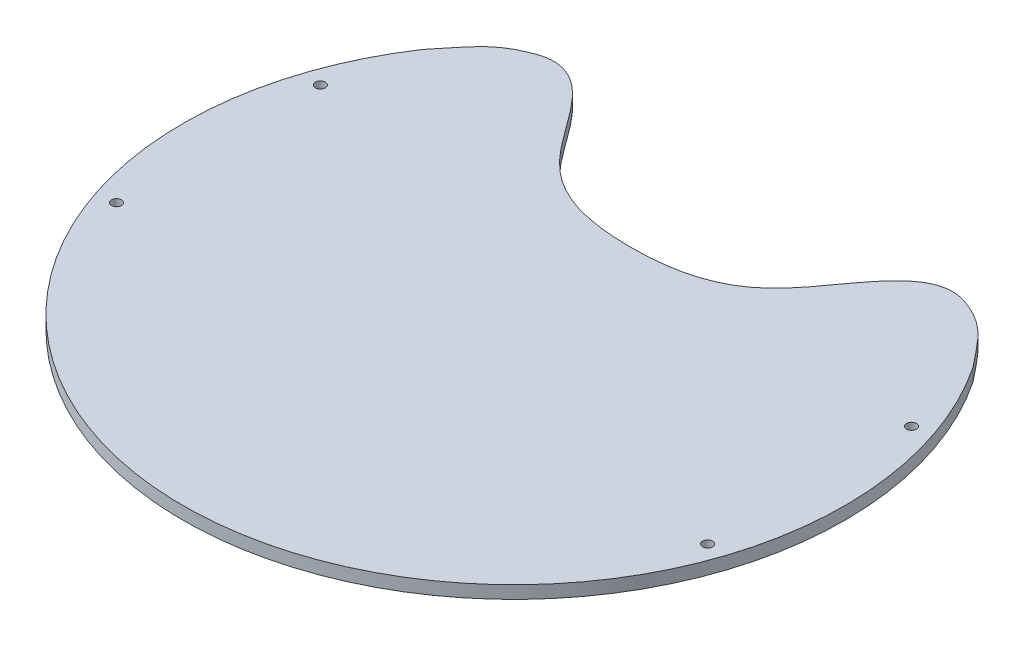
ISO-10303-21;
HEADER;
FILE_DESCRIPTION(('STEP AP214'),'2;1');
FILE_NAME('part.step','',(''),(''),'','','');
FILE_SCHEMA(('AUTOMOTIVE_DESIGN { 1 0 10303 214 1 1 1 1 }'));
ENDSEC;
DATA;
#1=APPLICATION_CONTEXT('core data for automotive mechanical design processes');
#2=APPLICATION_PROTOCOL_DEFINITION('international standard','automotive_design',2000,#1);
#3=PRODUCT_CONTEXT('',#1,'mechanical');
#4=PRODUCT('Part','Part','',(#3));
#5=PRODUCT_RELATED_PRODUCT_CATEGORY('part','',(#4));
#6=PRODUCT_DEFINITION_FORMATION('','',#4);
#7=PRODUCT_DEFINITION_CONTEXT('part definition',#1,'design');
#8=PRODUCT_DEFINITION('design','',#6,#7);
#9=PRODUCT_DEFINITION_SHAPE('','',#8);
#10=(LENGTH_UNIT() NAMED_UNIT(*) SI_UNIT(.MILLI.,.METRE.));
#11=(NAMED_UNIT(*) PLANE_ANGLE_UNIT() SI_UNIT($,.RADIAN.));
#12=(NAMED_UNIT(*) SI_UNIT($,.STERADIAN.) SOLID_ANGLE_UNIT());
#13=UNCERTAINTY_MEASURE_WITH_UNIT(LENGTH_MEASURE(1.E-05),#10,'distance_accuracy_value','');
#14=(GEOMETRIC_REPRESENTATION_CONTEXT(3) GLOBAL_UNCERTAINTY_ASSIGNED_CONTEXT((#13)) GLOBAL_UNIT_ASSIGNED_CONTEXT((#10,
#11,#12)) REPRESENTATION_CONTEXT('',''));
#15=CARTESIAN_POINT('',(0.,0.,0.));
#16=DIRECTION('',(0.,0.,1.));
#17=DIRECTION('',(1.,0.,0.));
#18=AXIS2_PLACEMENT_3D('',#15,#16,#17);
#19=CARTESIAN_POINT('',(0.,6.35,0.));
#20=DIRECTION('',(0.,-1.,0.));
#21=DIRECTION('',(0.,0.,-1.));
#22=AXIS2_PLACEMENT_3D('',#19,#20,#21);
#23=CYLINDRICAL_SURFACE('',#22,164.975);
#24=DIRECTION('',(0.,-1.,0.));
#25=VECTOR('',#24,1.);
#26=CARTESIAN_POINT('',(-137.173488464119,589.678712407293,-91.6525214469529));
#27=LINE('',#26,#25);
#28=CARTESIAN_POINT('',(-137.173488464119,6.35,-91.6525214469529));
#29=VERTEX_POINT('',#28);
#30=CARTESIAN_POINT('',(-137.173488464119,0.,-91.6525214469529));
#31=VERTEX_POINT('',#30);
#32=EDGE_CURVE('E83',#29,#31,#27,.T.);
#33=ORIENTED_EDGE('',*,*,#32,.T.);
#34=CARTESIAN_POINT('',(0.,0.,0.));
#35=DIRECTION('',(0.,1.,0.));
#36=DIRECTION('',(0.,0.,1.));
#37=AXIS2_PLACEMENT_3D('',#34,#35,#36);
#38=CIRCLE('',#37,164.975);
#39=CARTESIAN_POINT('',(137.173488464552,0.,-91.6525214463046));
#40=VERTEX_POINT('',#39);
#41=EDGE_CURVE('E70',#31,#40,#38,.T.);
#42=ORIENTED_EDGE('',*,*,#41,.T.);
#43=DIRECTION('',(0.,-1.,0.));
#44=VECTOR('',#43,1.);
#45=CARTESIAN_POINT('',(137.173488465523,589.678712407293,-91.652521446953));
#46=LINE('',#45,#44);
#47=CARTESIAN_POINT('',(137.173488464552,6.35,-91.6525214463046));
#48=VERTEX_POINT('',#47);
#49=EDGE_CURVE('E79',#48,#40,#46,.T.);
#50=ORIENTED_EDGE('',*,*,#49,.F.);
#51=CARTESIAN_POINT('',(0.,6.35,0.));
#52=DIRECTION('',(0.,1.,0.));
#53=DIRECTION('',(0.,0.,1.));
#54=AXIS2_PLACEMENT_3D('',#51,#52,#53);
#55=CIRCLE('',#54,164.975);
#56=EDGE_CURVE('E80',#29,#48,#55,.T.);
#57=ORIENTED_EDGE('',*,*,#56,.F.);
#58=EDGE_LOOP('',(#33,#42,#50,#57));
#59=FACE_BOUND('',#58,.T.);
#60=ADVANCED_FACE('F33',(#59),#23,.T.);
#61=CARTESIAN_POINT('',(0.,6.35,0.));
#62=DIRECTION('',(0.,1.,0.));
#63=DIRECTION('',(0.,0.,1.));
#64=AXIS2_PLACEMENT_3D('',#61,#62,#63);
#65=PLANE('',#64);
#66=CARTESIAN_POINT('',(147.32,6.35,50.8));
#67=DIRECTION('',(0.,1.,0.));
#68=DIRECTION('',(0.,0.,1.));
#69=AXIS2_PLACEMENT_3D('',#66,#67,#68);
#70=CIRCLE('',#69,2.4892);
#71=CARTESIAN_POINT('',(147.32,6.35,53.2892));
#72=VERTEX_POINT('',#71);
#73=EDGE_CURVE('E118',#72,#72,#70,.T.);
#74=ORIENTED_EDGE('',*,*,#73,.F.);
#75=EDGE_LOOP('',(#74));
#76=FACE_BOUND('',#75,.T.);
#77=CARTESIAN_POINT('',(147.32,6.35,-50.8));
#78=DIRECTION('',(0.,1.,0.));
#79=DIRECTION('',(0.,0.,1.));
#80=AXIS2_PLACEMENT_3D('',#77,#78,#79);
#81=CIRCLE('',#80,2.4892);
#82=CARTESIAN_POINT('',(147.32,6.35,-48.3108));
#83=VERTEX_POINT('',#82);
#84=EDGE_CURVE('E112',#83,#83,#81,.T.);
#85=ORIENTED_EDGE('',*,*,#84,.F.);
#86=EDGE_LOOP('',(#85));
#87=FACE_BOUND('',#86,.T.);
#88=CARTESIAN_POINT('',(-147.32,6.35,-50.8000000000011));
#89=DIRECTION('',(0.,1.,0.));
#90=DIRECTION('',(0.,0.,1.));
#91=AXIS2_PLACEMENT_3D('',#88,#89,#90);
#92=CIRCLE('',#91,2.4892);
#93=CARTESIAN_POINT('',(-147.32,6.35,-48.3108000000011));
#94=VERTEX_POINT('',#93);
#95=EDGE_CURVE('E106',#94,#94,#92,.T.);
#96=ORIENTED_EDGE('',*,*,#95,.F.);
#97=EDGE_LOOP('',(#96));
#98=FACE_BOUND('',#97,.T.);
#99=CARTESIAN_POINT('',(-147.32,6.35,50.7999999999991));
#100=DIRECTION('',(0.,1.,0.));
#101=DIRECTION('',(0.,0.,1.));
#102=AXIS2_PLACEMENT_3D('',#99,#100,#101);
#103=CIRCLE('',#102,2.4892);
#104=CARTESIAN_POINT('',(-147.32,6.35,53.2891999999991));
#105=VERTEX_POINT('',#104);
#106=EDGE_CURVE('E97',#105,#105,#103,.T.);
#107=ORIENTED_EDGE('',*,*,#106,.F.);
#108=EDGE_LOOP('',(#107));
#109=FACE_BOUND('',#108,.T.);
#110=CARTESIAN_POINT('',(7.01724567385018E-10,6.34999999999997,-58.1068345124423));
#111=CARTESIAN_POINT('',(42.1548417324569,6.34999999999997,-58.1068345124423));
#112=CARTESIAN_POINT('',(63.3632131183891,6.34999999999997,-88.0034410513127));
#113=CARTESIAN_POINT('',(90.3530975452781,6.34999999999997,-124.765284350819));
#114=CARTESIAN_POINT('',(120.870534516836,6.34999999999997,-112.27212259101));
#115=CARTESIAN_POINT('',(125.705159192573,6.34999999999997,-105.99655872717));
#116=CARTESIAN_POINT('',(137.173488465523,6.34999999999997,-91.652521446953));
#117=B_SPLINE_CURVE_WITH_KNOTS('',3,(#110,#111,#112,#113,#114,#115,#116),.UNSPECIFIED.,.F.,.F.,
(4,1,1,1,4),(0.,0.413171908580579,0.724986256730298,0.78366906587224,1.),.UNSPECIFIED.);
#118=CARTESIAN_POINT('',(7.01724567385018E-10,6.34999999999997,-58.1068345124423));
#119=VERTEX_POINT('',#118);
#120=EDGE_CURVE('E49',#48,#119,#117,.F.);
#121=ORIENTED_EDGE('',*,*,#120,.T.);
#122=CARTESIAN_POINT('',(-137.173488464119,6.34999999999997,-91.6525214469529));
#123=CARTESIAN_POINT('',(-125.705159191169,6.34999999999997,-105.99655872717));
#124=CARTESIAN_POINT('',(-120.870534515432,6.34999999999997,-112.272122591009));
#125=CARTESIAN_POINT('',(-90.3530975438746,6.34999999999997,-124.765284350819));
#126=CARTESIAN_POINT('',(-63.3632131169856,6.34999999999997,-88.0034410513127));
#127=CARTESIAN_POINT('',(-42.1548417310533,6.34999999999997,-58.1068345124422));
#128=CARTESIAN_POINT('',(7.01850930829921E-10,6.34999999999997,-58.1068345124423));
#129=B_SPLINE_CURVE_WITH_KNOTS('',3,(#122,#123,#124,#125,#126,#127,#128),.UNSPECIFIED.,.F.,.F.,
(4,1,1,1,4),(0.,0.21633093412776,0.275013743269702,0.586828091419421,1.),.UNSPECIFIED.);
#130=EDGE_CURVE('E52',#119,#29,#129,.F.);
#131=ORIENTED_EDGE('',*,*,#130,.T.);
#132=ORIENTED_EDGE('',*,*,#56,.T.);
#133=EDGE_LOOP('',(#121,#131,#132));
#134=FACE_BOUND('',#133,.T.);
#135=ADVANCED_FACE('F131',(#76,#87,#98,#109,#134),#65,.T.);
#136=CARTESIAN_POINT('',(0.,0.,0.));
#137=DIRECTION('',(0.,1.,0.));
#138=DIRECTION('',(0.,0.,1.));
#139=AXIS2_PLACEMENT_3D('',#136,#137,#138);
#140=PLANE('',#139);
#141=CARTESIAN_POINT('',(147.32,0.,50.8));
#142=DIRECTION('',(0.,1.,0.));
#143=DIRECTION('',(0.,0.,1.));
#144=AXIS2_PLACEMENT_3D('',#141,#142,#143);
#145=CIRCLE('',#144,2.4892);
#146=CARTESIAN_POINT('',(147.32,0.,53.2892));
#147=VERTEX_POINT('',#146);
#148=EDGE_CURVE('E121',#147,#147,#145,.T.);
#149=ORIENTED_EDGE('',*,*,#148,.T.);
#150=EDGE_LOOP('',(#149));
#151=FACE_BOUND('',#150,.T.);
#152=CARTESIAN_POINT('',(147.32,0.,-50.8));
#153=DIRECTION('',(0.,1.,0.));
#154=DIRECTION('',(0.,0.,1.));
#155=AXIS2_PLACEMENT_3D('',#152,#153,#154);
#156=CIRCLE('',#155,2.4892);
#157=CARTESIAN_POINT('',(147.32,0.,-48.3108));
#158=VERTEX_POINT('',#157);
#159=EDGE_CURVE('E115',#158,#158,#156,.T.);
#160=ORIENTED_EDGE('',*,*,#159,.T.);
#161=EDGE_LOOP('',(#160));
#162=FACE_BOUND('',#161,.T.);
#163=CARTESIAN_POINT('',(-147.32,0.,-50.8000000000011));
#164=DIRECTION('',(0.,1.,0.));
#165=DIRECTION('',(0.,0.,1.));
#166=AXIS2_PLACEMENT_3D('',#163,#164,#165);
#167=CIRCLE('',#166,2.4892);
#168=CARTESIAN_POINT('',(-147.32,0.,-48.3108000000011));
#169=VERTEX_POINT('',#168);
#170=EDGE_CURVE('E109',#169,#169,#167,.T.);
#171=ORIENTED_EDGE('',*,*,#170,.T.);
#172=EDGE_LOOP('',(#171));
#173=FACE_BOUND('',#172,.T.);
#174=CARTESIAN_POINT('',(-147.32,0.,50.7999999999991));
#175=DIRECTION('',(0.,1.,0.));
#176=DIRECTION('',(0.,0.,1.));
#177=AXIS2_PLACEMENT_3D('',#174,#175,#176);
#178=CIRCLE('',#177,2.4892);
#179=CARTESIAN_POINT('',(-147.32,0.,53.2891999999991));
#180=VERTEX_POINT('',#179);
#181=EDGE_CURVE('E103',#180,#180,#178,.T.);
#182=ORIENTED_EDGE('',*,*,#181,.T.);
#183=EDGE_LOOP('',(#182));
#184=FACE_BOUND('',#183,.T.);
#185=CARTESIAN_POINT('',(-137.173488464119,0.,-91.6525214469529));
#186=CARTESIAN_POINT('',(-125.705159191169,0.,-105.99655872717));
#187=CARTESIAN_POINT('',(-120.870534515432,0.,-112.272122591009));
#188=CARTESIAN_POINT('',(-90.3530975438746,0.,-124.765284350819));
#189=CARTESIAN_POINT('',(-63.3632131169856,0.,-88.0034410513127));
#190=CARTESIAN_POINT('',(-42.1548417310533,0.,-58.1068345124422));
#191=CARTESIAN_POINT('',(7.01850930829921E-10,0.,-58.1068345124423));
#192=B_SPLINE_CURVE_WITH_KNOTS('',3,(#185,#186,#187,#188,#189,#190,#191),.UNSPECIFIED.,.F.,.F.,
(4,1,1,1,4),(0.,0.21633093412776,0.275013743269702,0.586828091419421,1.),.UNSPECIFIED.);
#193=CARTESIAN_POINT('',(7.01850930829921E-10,0.,-58.1068345124423));
#194=VERTEX_POINT('',#193);
#195=EDGE_CURVE('E11',#194,#31,#192,.F.);
#196=ORIENTED_EDGE('',*,*,#195,.F.);
#197=CARTESIAN_POINT('',(7.01724567385018E-10,0.,-58.1068345124423));
#198=CARTESIAN_POINT('',(42.1548417324569,0.,-58.1068345124423));
#199=CARTESIAN_POINT('',(63.3632131183891,0.,-88.0034410513127));
#200=CARTESIAN_POINT('',(90.3530975452781,0.,-124.765284350819));
#201=CARTESIAN_POINT('',(120.870534516836,0.,-112.27212259101));
#202=CARTESIAN_POINT('',(125.705159192573,0.,-105.99655872717));
#203=CARTESIAN_POINT('',(137.173488465523,0.,-91.652521446953));
#204=B_SPLINE_CURVE_WITH_KNOTS('',3,(#197,#198,#199,#200,#201,#202,#203),.UNSPECIFIED.,.F.,.F.,
(4,1,1,1,4),(0.,0.413171908580579,0.724986256730298,0.78366906587224,1.),.UNSPECIFIED.);
#205=EDGE_CURVE('E42',#40,#194,#204,.F.);
#206=ORIENTED_EDGE('',*,*,#205,.F.);
#207=ORIENTED_EDGE('',*,*,#41,.F.);
#208=EDGE_LOOP('',(#196,#206,#207));
#209=FACE_BOUND('',#208,.T.);
#210=ADVANCED_FACE('F68',(#151,#162,#173,#184,#209),#140,.F.);
#211=CARTESIAN_POINT('',(147.32,6.35,50.8));
#212=DIRECTION('',(0.,1.,0.));
#213=DIRECTION('',(0.,0.,1.));
#214=AXIS2_PLACEMENT_3D('',#211,#212,#213);
#215=CYLINDRICAL_SURFACE('',#214,2.4892);
#216=ORIENTED_EDGE('',*,*,#148,.F.);
#217=EDGE_LOOP('',(#216));
#218=FACE_BOUND('',#217,.T.);
#219=ORIENTED_EDGE('',*,*,#73,.T.);
#220=EDGE_LOOP('',(#219));
#221=FACE_BOUND('',#220,.T.);
#222=ADVANCED_FACE('F139',(#218,#221),#215,.F.);
#223=CARTESIAN_POINT('',(147.32,6.35,-50.8));
#224=DIRECTION('',(0.,1.,0.));
#225=DIRECTION('',(0.,0.,1.));
#226=AXIS2_PLACEMENT_3D('',#223,#224,#225);
#227=CYLINDRICAL_SURFACE('',#226,2.4892);
#228=ORIENTED_EDGE('',*,*,#159,.F.);
#229=EDGE_LOOP('',(#228));
#230=FACE_BOUND('',#229,.T.);
#231=ORIENTED_EDGE('',*,*,#84,.T.);
#232=EDGE_LOOP('',(#231));
#233=FACE_BOUND('',#232,.T.);
#234=ADVANCED_FACE('F146',(#230,#233),#227,.F.);
#235=CARTESIAN_POINT('',(-147.32,6.35,-50.8000000000011));
#236=DIRECTION('',(0.,1.,0.));
#237=DIRECTION('',(0.,0.,1.));
#238=AXIS2_PLACEMENT_3D('',#235,#236,#237);
#239=CYLINDRICAL_SURFACE('',#238,2.4892);
#240=ORIENTED_EDGE('',*,*,#170,.F.);
#241=EDGE_LOOP('',(#240));
#242=FACE_BOUND('',#241,.T.);
#243=ORIENTED_EDGE('',*,*,#95,.T.);
#244=EDGE_LOOP('',(#243));
#245=FACE_BOUND('',#244,.T.);
#246=ADVANCED_FACE('F150',(#242,#245),#239,.F.);
#247=CARTESIAN_POINT('',(-147.32,6.35,50.7999999999991));
#248=DIRECTION('',(0.,1.,0.));
#249=DIRECTION('',(0.,0.,1.));
#250=AXIS2_PLACEMENT_3D('',#247,#248,#249);
#251=CYLINDRICAL_SURFACE('',#250,2.4892);
#252=ORIENTED_EDGE('',*,*,#181,.F.);
#253=EDGE_LOOP('',(#252));
#254=FACE_BOUND('',#253,.T.);
#255=ORIENTED_EDGE('',*,*,#106,.T.);
#256=EDGE_LOOP('',(#255));
#257=FACE_BOUND('',#256,.T.);
#258=ADVANCED_FACE('F154',(#254,#257),#251,.F.);
#259=CARTESIAN_POINT('',(-137.173488464119,589.678712407293,-91.6525214469529));
#260=CARTESIAN_POINT('',(-125.705159191169,589.678712407293,-105.99655872717));
#261=CARTESIAN_POINT('',(-120.870534515432,589.678712407293,-112.272122591009));
#262=CARTESIAN_POINT('',(-90.3530975438746,589.678712407293,-124.765284350819));
#263=CARTESIAN_POINT('',(-63.3632131169856,589.678712407293,-88.0034410513127));
#264=CARTESIAN_POINT('',(-42.1548417310533,589.678712407293,-58.1068345124422));
#265=CARTESIAN_POINT('',(7.01850930829921E-10,589.678712407293,-58.1068345124423));
#266=B_SPLINE_CURVE_WITH_KNOTS('',3,(#259,#260,#261,#262,#263,#264,#265),.UNSPECIFIED.,.F.,.F.,
(4,1,1,1,4),(0.,0.21633093412776,0.275013743269702,0.586828091419421,1.),.UNSPECIFIED.);
#267=DIRECTION('',(0.,-1.,0.));
#268=VECTOR('',#267,1.);
#269=SURFACE_OF_LINEAR_EXTRUSION('',#266,#268);
#270=ORIENTED_EDGE('',*,*,#130,.F.);
#271=DIRECTION('',(0.,-1.,0.));
#272=VECTOR('',#271,1.);
#273=CARTESIAN_POINT('',(7.01850930829921E-10,589.678712407293,-58.1068345124423));
#274=LINE('',#273,#272);
#275=EDGE_CURVE('E78',#119,#194,#274,.T.);
#276=ORIENTED_EDGE('',*,*,#275,.T.);
#277=ORIENTED_EDGE('',*,*,#195,.T.);
#278=ORIENTED_EDGE('',*,*,#32,.F.);
#279=EDGE_LOOP('',(#270,#276,#277,#278));
#280=FACE_BOUND('',#279,.T.);
#281=ADVANCED_FACE('F81',(#280),#269,.T.);
#282=CARTESIAN_POINT('',(7.01724567385018E-10,589.678712407293,-58.1068345124423));
#283=CARTESIAN_POINT('',(42.1548417324569,589.678712407293,-58.1068345124423));
#284=CARTESIAN_POINT('',(63.3632131183891,589.678712407293,-88.0034410513127));
#285=CARTESIAN_POINT('',(90.3530975452781,589.678712407293,-124.765284350819));
#286=CARTESIAN_POINT('',(120.870534516836,589.678712407293,-112.27212259101));
#287=CARTESIAN_POINT('',(125.705159192573,589.678712407293,-105.99655872717));
#288=CARTESIAN_POINT('',(137.173488465523,589.678712407293,-91.652521446953));
#289=B_SPLINE_CURVE_WITH_KNOTS('',3,(#282,#283,#284,#285,#286,#287,#288),.UNSPECIFIED.,.F.,.F.,
(4,1,1,1,4),(0.,0.413171908580579,0.724986256730298,0.78366906587224,1.),.UNSPECIFIED.);
#290=DIRECTION('',(0.,-1.,0.));
#291=VECTOR('',#290,1.);
#292=SURFACE_OF_LINEAR_EXTRUSION('',#289,#291);
#293=ORIENTED_EDGE('',*,*,#120,.F.);
#294=ORIENTED_EDGE('',*,*,#49,.T.);
#295=ORIENTED_EDGE('',*,*,#205,.T.);
#296=ORIENTED_EDGE('',*,*,#275,.F.);
#297=EDGE_LOOP('',(#293,#294,#295,#296));
#298=FACE_BOUND('',#297,.T.);
#299=ADVANCED_FACE('F77',(#298),#292,.T.);
#300=CLOSED_SHELL('',(#60,#135,#210,#222,#234,#246,#258,#281,#299));
#301=MANIFOLD_SOLID_BREP('B2',#300);
#302=ADVANCED_BREP_SHAPE_REPRESENTATION('',(#18,#301),#14);
#303=SHAPE_DEFINITION_REPRESENTATION(#9,#302);
ENDSEC;
END-ISO-10303-21;
